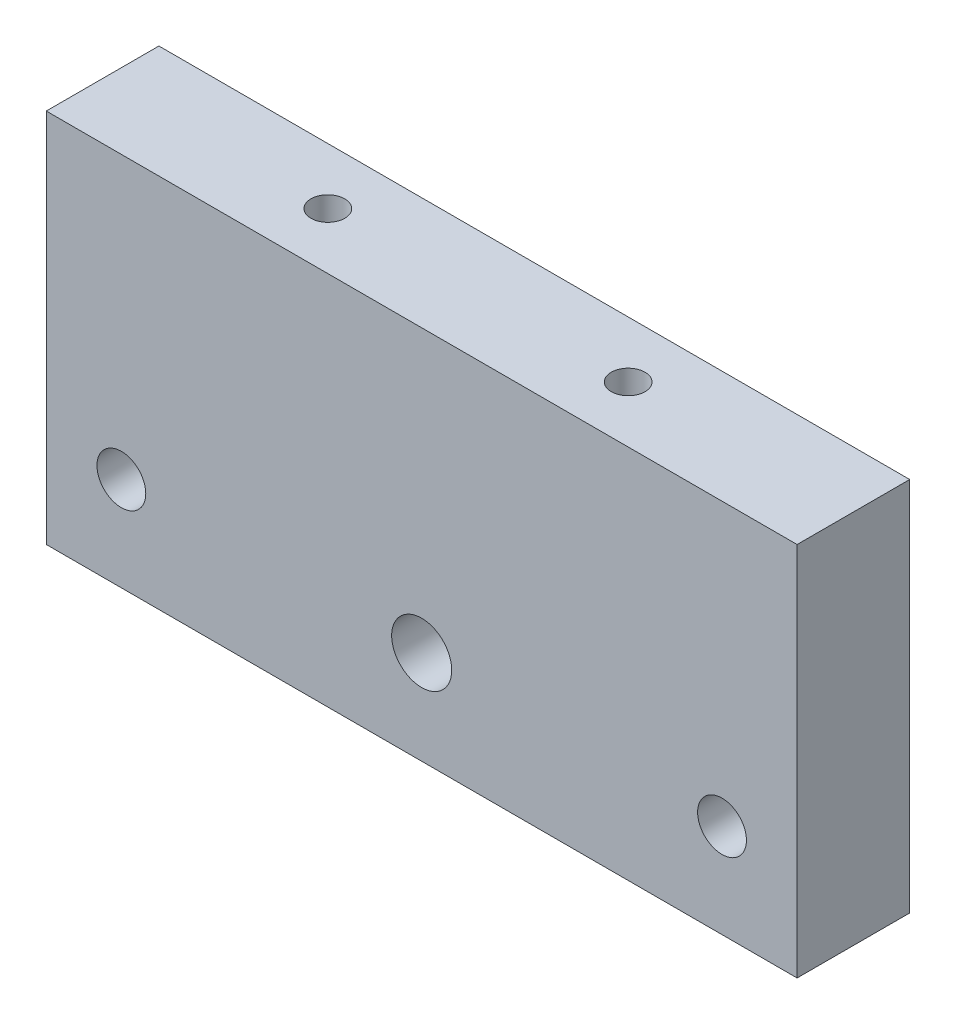
ISO-10303-21;
HEADER;
FILE_DESCRIPTION(('STEP AP214'),'2;1');
FILE_NAME('part.step','',(''),(''),'','','');
FILE_SCHEMA(('AUTOMOTIVE_DESIGN { 1 0 10303 214 1 1 1 1 }'));
ENDSEC;
DATA;
#1=APPLICATION_CONTEXT('core data for automotive mechanical design processes');
#2=APPLICATION_PROTOCOL_DEFINITION('international standard','automotive_design',2000,#1);
#3=PRODUCT_CONTEXT('',#1,'mechanical');
#4=PRODUCT('Part','Part','',(#3));
#5=PRODUCT_RELATED_PRODUCT_CATEGORY('part','',(#4));
#6=PRODUCT_DEFINITION_FORMATION('','',#4);
#7=PRODUCT_DEFINITION_CONTEXT('part definition',#1,'design');
#8=PRODUCT_DEFINITION('design','',#6,#7);
#9=PRODUCT_DEFINITION_SHAPE('','',#8);
#10=(LENGTH_UNIT() NAMED_UNIT(*) SI_UNIT(.MILLI.,.METRE.));
#11=(NAMED_UNIT(*) PLANE_ANGLE_UNIT() SI_UNIT($,.RADIAN.));
#12=(NAMED_UNIT(*) SI_UNIT($,.STERADIAN.) SOLID_ANGLE_UNIT());
#13=UNCERTAINTY_MEASURE_WITH_UNIT(LENGTH_MEASURE(1.E-05),#10,'distance_accuracy_value','');
#14=(GEOMETRIC_REPRESENTATION_CONTEXT(3) GLOBAL_UNCERTAINTY_ASSIGNED_CONTEXT((#13)) GLOBAL_UNIT_ASSIGNED_CONTEXT((#10,
#11,#12)) REPRESENTATION_CONTEXT('',''));
#15=CARTESIAN_POINT('',(0.,0.,0.));
#16=DIRECTION('',(0.,0.,1.));
#17=DIRECTION('',(1.,0.,0.));
#18=AXIS2_PLACEMENT_3D('',#15,#16,#17);
#19=CARTESIAN_POINT('',(100.,25.,0.));
#20=DIRECTION('',(0.,0.,1.));
#21=DIRECTION('',(1.,0.,0.));
#22=AXIS2_PLACEMENT_3D('',#19,#20,#21);
#23=CYLINDRICAL_SURFACE('',#22,8.00000000000001);
#24=CARTESIAN_POINT('',(100.,25.,30.));
#25=DIRECTION('',(0.,0.,1.));
#26=DIRECTION('',(1.,0.,0.));
#27=AXIS2_PLACEMENT_3D('',#24,#25,#26);
#28=CIRCLE('',#27,8.00000000000001);
#29=CARTESIAN_POINT('',(108.,25.,30.));
#30=VERTEX_POINT('',#29);
#31=EDGE_CURVE('E163',#30,#30,#28,.T.);
#32=ORIENTED_EDGE('',*,*,#31,.T.);
#33=EDGE_LOOP('',(#32));
#34=FACE_BOUND('',#33,.T.);
#35=CARTESIAN_POINT('',(100.,25.,15.));
#36=DIRECTION('',(0.,0.,-1.));
#37=DIRECTION('',(-1.,0.,0.));
#38=AXIS2_PLACEMENT_3D('',#35,#36,#37);
#39=CIRCLE('',#38,8.00000000000001);
#40=CARTESIAN_POINT('',(92.,25.,15.));
#41=VERTEX_POINT('',#40);
#42=EDGE_CURVE('E40',#41,#41,#39,.F.);
#43=ORIENTED_EDGE('',*,*,#42,.F.);
#44=EDGE_LOOP('',(#43));
#45=FACE_BOUND('',#44,.T.);
#46=ADVANCED_FACE('F36',(#34,#45),#23,.F.);
#47=CARTESIAN_POINT('',(180.,25.,0.));
#48=DIRECTION('',(0.,0.,1.));
#49=DIRECTION('',(1.,0.,0.));
#50=AXIS2_PLACEMENT_3D('',#47,#48,#49);
#51=CYLINDRICAL_SURFACE('',#50,4.49999999999999);
#52=CARTESIAN_POINT('',(180.,25.,0.));
#53=DIRECTION('',(0.,0.,1.));
#54=DIRECTION('',(1.,0.,0.));
#55=AXIS2_PLACEMENT_3D('',#52,#53,#54);
#56=CIRCLE('',#55,4.49999999999999);
#57=CARTESIAN_POINT('',(184.5,25.,0.));
#58=VERTEX_POINT('',#57);
#59=EDGE_CURVE('E160',#58,#58,#56,.T.);
#60=ORIENTED_EDGE('',*,*,#59,.F.);
#61=EDGE_LOOP('',(#60));
#62=FACE_BOUND('',#61,.T.);
#63=CARTESIAN_POINT('',(180.,25.,15.));
#64=DIRECTION('',(0.,0.,1.));
#65=DIRECTION('',(1.,0.,0.));
#66=AXIS2_PLACEMENT_3D('',#63,#64,#65);
#67=CIRCLE('',#66,4.49999999999999);
#68=CARTESIAN_POINT('',(184.5,25.,15.));
#69=VERTEX_POINT('',#68);
#70=EDGE_CURVE('E126',#69,#69,#67,.F.);
#71=ORIENTED_EDGE('',*,*,#70,.F.);
#72=EDGE_LOOP('',(#71));
#73=FACE_BOUND('',#72,.T.);
#74=ADVANCED_FACE('F176',(#62,#73),#51,.F.);
#75=CARTESIAN_POINT('',(20.,25.,0.));
#76=DIRECTION('',(0.,0.,1.));
#77=DIRECTION('',(1.,0.,0.));
#78=AXIS2_PLACEMENT_3D('',#75,#76,#77);
#79=CYLINDRICAL_SURFACE('',#78,4.5);
#80=CARTESIAN_POINT('',(20.,25.,0.));
#81=DIRECTION('',(0.,0.,1.));
#82=DIRECTION('',(1.,0.,0.));
#83=AXIS2_PLACEMENT_3D('',#80,#81,#82);
#84=CIRCLE('',#83,4.5);
#85=CARTESIAN_POINT('',(24.5,25.,0.));
#86=VERTEX_POINT('',#85);
#87=EDGE_CURVE('E106',#86,#86,#84,.T.);
#88=ORIENTED_EDGE('',*,*,#87,.F.);
#89=EDGE_LOOP('',(#88));
#90=FACE_BOUND('',#89,.T.);
#91=CARTESIAN_POINT('',(20.,25.,15.));
#92=DIRECTION('',(0.,0.,1.));
#93=DIRECTION('',(1.,0.,0.));
#94=AXIS2_PLACEMENT_3D('',#91,#92,#93);
#95=CIRCLE('',#94,4.5);
#96=CARTESIAN_POINT('',(24.5,25.,15.));
#97=VERTEX_POINT('',#96);
#98=EDGE_CURVE('E122',#97,#97,#95,.F.);
#99=ORIENTED_EDGE('',*,*,#98,.F.);
#100=EDGE_LOOP('',(#99));
#101=FACE_BOUND('',#100,.T.);
#102=ADVANCED_FACE('F172',(#90,#101),#79,.F.);
#103=CARTESIAN_POINT('',(140.,100.,15.));
#104=DIRECTION('',(0.,-1.,0.));
#105=DIRECTION('',(0.,0.,-1.));
#106=AXIS2_PLACEMENT_3D('',#103,#104,#105);
#107=CYLINDRICAL_SURFACE('',#106,4.49999999999999);
#108=CARTESIAN_POINT('',(140.,100.,15.));
#109=DIRECTION('',(0.,-1.,0.));
#110=DIRECTION('',(0.,0.,-1.));
#111=AXIS2_PLACEMENT_3D('',#108,#109,#110);
#112=CIRCLE('',#111,4.49999999999999);
#113=CARTESIAN_POINT('',(140.,100.,10.5));
#114=VERTEX_POINT('',#113);
#115=EDGE_CURVE('E115',#114,#114,#112,.T.);
#116=ORIENTED_EDGE('',*,*,#115,.F.);
#117=EDGE_LOOP('',(#116));
#118=FACE_BOUND('',#117,.T.);
#119=CARTESIAN_POINT('',(140.,50.,15.));
#120=DIRECTION('',(0.,-1.,0.));
#121=DIRECTION('',(0.,0.,-1.));
#122=AXIS2_PLACEMENT_3D('',#119,#120,#121);
#123=CIRCLE('',#122,4.49999999999999);
#124=CARTESIAN_POINT('',(140.,50.,10.5));
#125=VERTEX_POINT('',#124);
#126=EDGE_CURVE('E117',#125,#125,#123,.F.);
#127=ORIENTED_EDGE('',*,*,#126,.F.);
#128=EDGE_LOOP('',(#127));
#129=FACE_BOUND('',#128,.T.);
#130=ADVANCED_FACE('F175',(#118,#129),#107,.F.);
#131=CARTESIAN_POINT('',(60.,100.,15.));
#132=DIRECTION('',(0.,-1.,0.));
#133=DIRECTION('',(0.,0.,-1.));
#134=AXIS2_PLACEMENT_3D('',#131,#132,#133);
#135=CYLINDRICAL_SURFACE('',#134,4.5);
#136=CARTESIAN_POINT('',(60.,100.,15.));
#137=DIRECTION('',(0.,-1.,0.));
#138=DIRECTION('',(0.,0.,-1.));
#139=AXIS2_PLACEMENT_3D('',#136,#137,#138);
#140=CIRCLE('',#139,4.5);
#141=CARTESIAN_POINT('',(60.,100.,10.5));
#142=VERTEX_POINT('',#141);
#143=EDGE_CURVE('E157',#142,#142,#140,.T.);
#144=ORIENTED_EDGE('',*,*,#143,.F.);
#145=EDGE_LOOP('',(#144));
#146=FACE_BOUND('',#145,.T.);
#147=CARTESIAN_POINT('',(60.,50.,15.));
#148=DIRECTION('',(0.,-1.,0.));
#149=DIRECTION('',(0.,0.,-1.));
#150=AXIS2_PLACEMENT_3D('',#147,#148,#149);
#151=CIRCLE('',#150,4.5);
#152=CARTESIAN_POINT('',(60.,50.,10.5));
#153=VERTEX_POINT('',#152);
#154=EDGE_CURVE('E112',#153,#153,#151,.F.);
#155=ORIENTED_EDGE('',*,*,#154,.F.);
#156=EDGE_LOOP('',(#155));
#157=FACE_BOUND('',#156,.T.);
#158=ADVANCED_FACE('F225',(#146,#157),#135,.F.);
#159=CARTESIAN_POINT('',(0.,0.,30.));
#160=DIRECTION('',(1.,0.,0.));
#161=DIRECTION('',(0.,0.,-1.));
#162=AXIS2_PLACEMENT_3D('',#159,#160,#161);
#163=PLANE('',#162);
#164=DIRECTION('',(0.,-1.,0.));
#165=VECTOR('',#164,1.);
#166=CARTESIAN_POINT('',(0.,0.,0.));
#167=LINE('',#166,#165);
#168=CARTESIAN_POINT('',(0.,100.,0.));
#169=VERTEX_POINT('',#168);
#170=CARTESIAN_POINT('',(0.,0.,0.));
#171=VERTEX_POINT('',#170);
#172=EDGE_CURVE('E103',#169,#171,#167,.T.);
#173=ORIENTED_EDGE('',*,*,#172,.T.);
#174=DIRECTION('',(0.,0.,-1.));
#175=VECTOR('',#174,1.);
#176=CARTESIAN_POINT('',(0.,0.,30.));
#177=LINE('',#176,#175);
#178=CARTESIAN_POINT('',(0.,0.,30.));
#179=VERTEX_POINT('',#178);
#180=EDGE_CURVE('E11',#179,#171,#177,.T.);
#181=ORIENTED_EDGE('',*,*,#180,.F.);
#182=DIRECTION('',(0.,-1.,0.));
#183=VECTOR('',#182,1.);
#184=CARTESIAN_POINT('',(0.,0.,30.));
#185=LINE('',#184,#183);
#186=CARTESIAN_POINT('',(0.,100.,30.));
#187=VERTEX_POINT('',#186);
#188=EDGE_CURVE('E90',#187,#179,#185,.T.);
#189=ORIENTED_EDGE('',*,*,#188,.F.);
#190=DIRECTION('',(0.,0.,-1.));
#191=VECTOR('',#190,1.);
#192=CARTESIAN_POINT('',(0.,100.,30.));
#193=LINE('',#192,#191);
#194=EDGE_CURVE('E99',#187,#169,#193,.T.);
#195=ORIENTED_EDGE('',*,*,#194,.T.);
#196=EDGE_LOOP('',(#173,#181,#189,#195));
#197=FACE_BOUND('',#196,.T.);
#198=ADVANCED_FACE('F38',(#197),#163,.F.);
#199=CARTESIAN_POINT('',(0.,0.,30.));
#200=DIRECTION('',(0.,1.,0.));
#201=DIRECTION('',(0.,0.,1.));
#202=AXIS2_PLACEMENT_3D('',#199,#200,#201);
#203=PLANE('',#202);
#204=CARTESIAN_POINT('',(140.,0.,15.));
#205=DIRECTION('',(0.,-1.,0.));
#206=DIRECTION('',(0.,0.,-1.));
#207=AXIS2_PLACEMENT_3D('',#204,#205,#206);
#208=CIRCLE('',#207,6.50000000000002);
#209=CARTESIAN_POINT('',(140.,0.,8.49999999999998));
#210=VERTEX_POINT('',#209);
#211=EDGE_CURVE('E124',#210,#210,#208,.T.);
#212=ORIENTED_EDGE('',*,*,#211,.F.);
#213=EDGE_LOOP('',(#212));
#214=FACE_BOUND('',#213,.T.);
#215=CARTESIAN_POINT('',(60.,0.,15.));
#216=DIRECTION('',(0.,-1.,0.));
#217=DIRECTION('',(0.,0.,-1.));
#218=AXIS2_PLACEMENT_3D('',#215,#216,#217);
#219=CIRCLE('',#218,6.5);
#220=CARTESIAN_POINT('',(60.,0.,8.5));
#221=VERTEX_POINT('',#220);
#222=EDGE_CURVE('E120',#221,#221,#219,.T.);
#223=ORIENTED_EDGE('',*,*,#222,.F.);
#224=EDGE_LOOP('',(#223));
#225=FACE_BOUND('',#224,.T.);
#226=DIRECTION('',(1.,0.,0.));
#227=VECTOR('',#226,1.);
#228=CARTESIAN_POINT('',(0.,0.,0.));
#229=LINE('',#228,#227);
#230=CARTESIAN_POINT('',(200.,0.,0.));
#231=VERTEX_POINT('',#230);
#232=EDGE_CURVE('E94',#171,#231,#229,.T.);
#233=ORIENTED_EDGE('',*,*,#232,.T.);
#234=DIRECTION('',(0.,0.,-1.));
#235=VECTOR('',#234,1.);
#236=CARTESIAN_POINT('',(200.,0.,30.));
#237=LINE('',#236,#235);
#238=CARTESIAN_POINT('',(200.,0.,30.));
#239=VERTEX_POINT('',#238);
#240=EDGE_CURVE('E46',#239,#231,#237,.T.);
#241=ORIENTED_EDGE('',*,*,#240,.F.);
#242=DIRECTION('',(1.,0.,0.));
#243=VECTOR('',#242,1.);
#244=CARTESIAN_POINT('',(0.,0.,30.));
#245=LINE('',#244,#243);
#246=EDGE_CURVE('E85',#179,#239,#245,.T.);
#247=ORIENTED_EDGE('',*,*,#246,.F.);
#248=ORIENTED_EDGE('',*,*,#180,.T.);
#249=EDGE_LOOP('',(#233,#241,#247,#248));
#250=FACE_BOUND('',#249,.T.);
#251=ADVANCED_FACE('F93',(#214,#225,#250),#203,.F.);
#252=CARTESIAN_POINT('',(200.,0.,30.));
#253=DIRECTION('',(-1.,0.,0.));
#254=DIRECTION('',(0.,0.,1.));
#255=AXIS2_PLACEMENT_3D('',#252,#253,#254);
#256=PLANE('',#255);
#257=DIRECTION('',(0.,1.,0.));
#258=VECTOR('',#257,1.);
#259=CARTESIAN_POINT('',(200.,0.,0.));
#260=LINE('',#259,#258);
#261=CARTESIAN_POINT('',(200.,100.,0.));
#262=VERTEX_POINT('',#261);
#263=EDGE_CURVE('E72',#231,#262,#260,.T.);
#264=ORIENTED_EDGE('',*,*,#263,.T.);
#265=DIRECTION('',(0.,0.,-1.));
#266=VECTOR('',#265,1.);
#267=CARTESIAN_POINT('',(200.,100.,30.));
#268=LINE('',#267,#266);
#269=CARTESIAN_POINT('',(200.,100.,30.));
#270=VERTEX_POINT('',#269);
#271=EDGE_CURVE('E95',#270,#262,#268,.T.);
#272=ORIENTED_EDGE('',*,*,#271,.F.);
#273=DIRECTION('',(0.,1.,0.));
#274=VECTOR('',#273,1.);
#275=CARTESIAN_POINT('',(200.,0.,30.));
#276=LINE('',#275,#274);
#277=EDGE_CURVE('E88',#239,#270,#276,.T.);
#278=ORIENTED_EDGE('',*,*,#277,.F.);
#279=ORIENTED_EDGE('',*,*,#240,.T.);
#280=EDGE_LOOP('',(#264,#272,#278,#279));
#281=FACE_BOUND('',#280,.T.);
#282=ADVANCED_FACE('F97',(#281),#256,.F.);
#283=CARTESIAN_POINT('',(0.,100.,30.));
#284=DIRECTION('',(0.,-1.,0.));
#285=DIRECTION('',(0.,0.,-1.));
#286=AXIS2_PLACEMENT_3D('',#283,#284,#285);
#287=PLANE('',#286);
#288=ORIENTED_EDGE('',*,*,#115,.T.);
#289=EDGE_LOOP('',(#288));
#290=FACE_BOUND('',#289,.T.);
#291=ORIENTED_EDGE('',*,*,#143,.T.);
#292=EDGE_LOOP('',(#291));
#293=FACE_BOUND('',#292,.T.);
#294=DIRECTION('',(-1.,0.,0.));
#295=VECTOR('',#294,1.);
#296=CARTESIAN_POINT('',(0.,100.,0.));
#297=LINE('',#296,#295);
#298=EDGE_CURVE('E78',#262,#169,#297,.T.);
#299=ORIENTED_EDGE('',*,*,#298,.T.);
#300=ORIENTED_EDGE('',*,*,#194,.F.);
#301=DIRECTION('',(-1.,0.,0.));
#302=VECTOR('',#301,1.);
#303=CARTESIAN_POINT('',(0.,100.,30.));
#304=LINE('',#303,#302);
#305=EDGE_CURVE('E55',#270,#187,#304,.T.);
#306=ORIENTED_EDGE('',*,*,#305,.F.);
#307=ORIENTED_EDGE('',*,*,#271,.T.);
#308=EDGE_LOOP('',(#299,#300,#306,#307));
#309=FACE_BOUND('',#308,.T.);
#310=ADVANCED_FACE('F210',(#290,#293,#309),#287,.F.);
#311=CARTESIAN_POINT('',(0.,0.,30.));
#312=DIRECTION('',(0.,0.,-1.));
#313=DIRECTION('',(-1.,0.,0.));
#314=AXIS2_PLACEMENT_3D('',#311,#312,#313);
#315=PLANE('',#314);
#316=CARTESIAN_POINT('',(180.,25.,30.));
#317=DIRECTION('',(0.,0.,1.));
#318=DIRECTION('',(1.,0.,0.));
#319=AXIS2_PLACEMENT_3D('',#316,#317,#318);
#320=CIRCLE('',#319,6.50000000000002);
#321=CARTESIAN_POINT('',(186.5,25.,30.));
#322=VERTEX_POINT('',#321);
#323=EDGE_CURVE('E135',#322,#322,#320,.T.);
#324=ORIENTED_EDGE('',*,*,#323,.F.);
#325=EDGE_LOOP('',(#324));
#326=FACE_BOUND('',#325,.T.);
#327=CARTESIAN_POINT('',(20.,25.,30.));
#328=DIRECTION('',(0.,0.,1.));
#329=DIRECTION('',(1.,0.,0.));
#330=AXIS2_PLACEMENT_3D('',#327,#328,#329);
#331=CIRCLE('',#330,6.5);
#332=CARTESIAN_POINT('',(26.5,25.,30.));
#333=VERTEX_POINT('',#332);
#334=EDGE_CURVE('E128',#333,#333,#331,.T.);
#335=ORIENTED_EDGE('',*,*,#334,.F.);
#336=EDGE_LOOP('',(#335));
#337=FACE_BOUND('',#336,.T.);
#338=ORIENTED_EDGE('',*,*,#31,.F.);
#339=EDGE_LOOP('',(#338));
#340=FACE_BOUND('',#339,.T.);
#341=ORIENTED_EDGE('',*,*,#188,.T.);
#342=ORIENTED_EDGE('',*,*,#246,.T.);
#343=ORIENTED_EDGE('',*,*,#277,.T.);
#344=ORIENTED_EDGE('',*,*,#305,.T.);
#345=EDGE_LOOP('',(#341,#342,#343,#344));
#346=FACE_BOUND('',#345,.T.);
#347=ADVANCED_FACE('F86',(#326,#337,#340,#346),#315,.F.);
#348=CARTESIAN_POINT('',(0.,0.,0.));
#349=DIRECTION('',(0.,0.,-1.));
#350=DIRECTION('',(-1.,0.,0.));
#351=AXIS2_PLACEMENT_3D('',#348,#349,#350);
#352=PLANE('',#351);
#353=CARTESIAN_POINT('',(100.,25.,0.));
#354=DIRECTION('',(0.,0.,-1.));
#355=DIRECTION('',(-1.,0.,0.));
#356=AXIS2_PLACEMENT_3D('',#353,#354,#355);
#357=CIRCLE('',#356,12.);
#358=CARTESIAN_POINT('',(88.,25.,0.));
#359=VERTEX_POINT('',#358);
#360=EDGE_CURVE('E142',#359,#359,#357,.T.);
#361=ORIENTED_EDGE('',*,*,#360,.F.);
#362=EDGE_LOOP('',(#361));
#363=FACE_BOUND('',#362,.T.);
#364=ORIENTED_EDGE('',*,*,#59,.T.);
#365=EDGE_LOOP('',(#364));
#366=FACE_BOUND('',#365,.T.);
#367=ORIENTED_EDGE('',*,*,#87,.T.);
#368=EDGE_LOOP('',(#367));
#369=FACE_BOUND('',#368,.T.);
#370=ORIENTED_EDGE('',*,*,#172,.F.);
#371=ORIENTED_EDGE('',*,*,#298,.F.);
#372=ORIENTED_EDGE('',*,*,#263,.F.);
#373=ORIENTED_EDGE('',*,*,#232,.F.);
#374=EDGE_LOOP('',(#370,#371,#372,#373));
#375=FACE_BOUND('',#374,.T.);
#376=ADVANCED_FACE('F169',(#363,#366,#369,#375),#352,.T.);
#377=CARTESIAN_POINT('',(60.,50.,15.));
#378=DIRECTION('',(0.,-1.,0.));
#379=DIRECTION('',(0.,0.,-1.));
#380=AXIS2_PLACEMENT_3D('',#377,#378,#379);
#381=PLANE('',#380);
#382=CARTESIAN_POINT('',(60.,50.,15.));
#383=DIRECTION('',(0.,-1.,0.));
#384=DIRECTION('',(0.,0.,-1.));
#385=AXIS2_PLACEMENT_3D('',#382,#383,#384);
#386=CIRCLE('',#385,6.5);
#387=CARTESIAN_POINT('',(60.,50.,8.5));
#388=VERTEX_POINT('',#387);
#389=EDGE_CURVE('E116',#388,#388,#386,.T.);
#390=ORIENTED_EDGE('',*,*,#389,.T.);
#391=EDGE_LOOP('',(#390));
#392=FACE_BOUND('',#391,.T.);
#393=ORIENTED_EDGE('',*,*,#154,.T.);
#394=EDGE_LOOP('',(#393));
#395=FACE_BOUND('',#394,.T.);
#396=ADVANCED_FACE('F214',(#392,#395),#381,.T.);
#397=CARTESIAN_POINT('',(60.,50.,15.));
#398=DIRECTION('',(0.,-1.,0.));
#399=DIRECTION('',(0.,0.,-1.));
#400=AXIS2_PLACEMENT_3D('',#397,#398,#399);
#401=CYLINDRICAL_SURFACE('',#400,6.5);
#402=ORIENTED_EDGE('',*,*,#389,.F.);
#403=EDGE_LOOP('',(#402));
#404=FACE_BOUND('',#403,.T.);
#405=ORIENTED_EDGE('',*,*,#222,.T.);
#406=EDGE_LOOP('',(#405));
#407=FACE_BOUND('',#406,.T.);
#408=ADVANCED_FACE('F231',(#404,#407),#401,.F.);
#409=CARTESIAN_POINT('',(140.,50.,15.));
#410=DIRECTION('',(0.,-1.,0.));
#411=DIRECTION('',(0.,0.,-1.));
#412=AXIS2_PLACEMENT_3D('',#409,#410,#411);
#413=PLANE('',#412);
#414=CARTESIAN_POINT('',(140.,50.,15.));
#415=DIRECTION('',(0.,-1.,0.));
#416=DIRECTION('',(0.,0.,-1.));
#417=AXIS2_PLACEMENT_3D('',#414,#415,#416);
#418=CIRCLE('',#417,6.50000000000002);
#419=CARTESIAN_POINT('',(140.,50.,8.49999999999998));
#420=VERTEX_POINT('',#419);
#421=EDGE_CURVE('E121',#420,#420,#418,.T.);
#422=ORIENTED_EDGE('',*,*,#421,.T.);
#423=EDGE_LOOP('',(#422));
#424=FACE_BOUND('',#423,.T.);
#425=ORIENTED_EDGE('',*,*,#126,.T.);
#426=EDGE_LOOP('',(#425));
#427=FACE_BOUND('',#426,.T.);
#428=ADVANCED_FACE('F193',(#424,#427),#413,.T.);
#429=CARTESIAN_POINT('',(140.,50.,15.));
#430=DIRECTION('',(0.,-1.,0.));
#431=DIRECTION('',(0.,0.,-1.));
#432=AXIS2_PLACEMENT_3D('',#429,#430,#431);
#433=CYLINDRICAL_SURFACE('',#432,6.50000000000002);
#434=ORIENTED_EDGE('',*,*,#421,.F.);
#435=EDGE_LOOP('',(#434));
#436=FACE_BOUND('',#435,.T.);
#437=ORIENTED_EDGE('',*,*,#211,.T.);
#438=EDGE_LOOP('',(#437));
#439=FACE_BOUND('',#438,.T.);
#440=ADVANCED_FACE('F183',(#436,#439),#433,.F.);
#441=CARTESIAN_POINT('',(20.,25.,15.));
#442=DIRECTION('',(0.,0.,1.));
#443=DIRECTION('',(1.,0.,0.));
#444=AXIS2_PLACEMENT_3D('',#441,#442,#443);
#445=PLANE('',#444);
#446=CARTESIAN_POINT('',(20.,25.,15.));
#447=DIRECTION('',(0.,0.,1.));
#448=DIRECTION('',(1.,0.,0.));
#449=AXIS2_PLACEMENT_3D('',#446,#447,#448);
#450=CIRCLE('',#449,6.5);
#451=CARTESIAN_POINT('',(26.5,25.,15.));
#452=VERTEX_POINT('',#451);
#453=EDGE_CURVE('E125',#452,#452,#450,.T.);
#454=ORIENTED_EDGE('',*,*,#453,.T.);
#455=EDGE_LOOP('',(#454));
#456=FACE_BOUND('',#455,.T.);
#457=ORIENTED_EDGE('',*,*,#98,.T.);
#458=EDGE_LOOP('',(#457));
#459=FACE_BOUND('',#458,.T.);
#460=ADVANCED_FACE('F180',(#456,#459),#445,.T.);
#461=CARTESIAN_POINT('',(20.,25.,15.));
#462=DIRECTION('',(0.,0.,1.));
#463=DIRECTION('',(1.,0.,0.));
#464=AXIS2_PLACEMENT_3D('',#461,#462,#463);
#465=CYLINDRICAL_SURFACE('',#464,6.5);
#466=ORIENTED_EDGE('',*,*,#453,.F.);
#467=EDGE_LOOP('',(#466));
#468=FACE_BOUND('',#467,.T.);
#469=ORIENTED_EDGE('',*,*,#334,.T.);
#470=EDGE_LOOP('',(#469));
#471=FACE_BOUND('',#470,.T.);
#472=ADVANCED_FACE('F182',(#468,#471),#465,.F.);
#473=CARTESIAN_POINT('',(180.,25.,15.));
#474=DIRECTION('',(0.,0.,1.));
#475=DIRECTION('',(1.,0.,0.));
#476=AXIS2_PLACEMENT_3D('',#473,#474,#475);
#477=PLANE('',#476);
#478=CARTESIAN_POINT('',(180.,25.,15.));
#479=DIRECTION('',(0.,0.,1.));
#480=DIRECTION('',(1.,0.,0.));
#481=AXIS2_PLACEMENT_3D('',#478,#479,#480);
#482=CIRCLE('',#481,6.50000000000002);
#483=CARTESIAN_POINT('',(186.5,25.,15.));
#484=VERTEX_POINT('',#483);
#485=EDGE_CURVE('E129',#484,#484,#482,.T.);
#486=ORIENTED_EDGE('',*,*,#485,.T.);
#487=EDGE_LOOP('',(#486));
#488=FACE_BOUND('',#487,.T.);
#489=ORIENTED_EDGE('',*,*,#70,.T.);
#490=EDGE_LOOP('',(#489));
#491=FACE_BOUND('',#490,.T.);
#492=ADVANCED_FACE('F190',(#488,#491),#477,.T.);
#493=CARTESIAN_POINT('',(180.,25.,15.));
#494=DIRECTION('',(0.,0.,1.));
#495=DIRECTION('',(1.,0.,0.));
#496=AXIS2_PLACEMENT_3D('',#493,#494,#495);
#497=CYLINDRICAL_SURFACE('',#496,6.50000000000002);
#498=ORIENTED_EDGE('',*,*,#485,.F.);
#499=EDGE_LOOP('',(#498));
#500=FACE_BOUND('',#499,.T.);
#501=ORIENTED_EDGE('',*,*,#323,.T.);
#502=EDGE_LOOP('',(#501));
#503=FACE_BOUND('',#502,.T.);
#504=ADVANCED_FACE('F336',(#500,#503),#497,.F.);
#505=CARTESIAN_POINT('',(100.,25.,15.));
#506=DIRECTION('',(0.,0.,-1.));
#507=DIRECTION('',(-1.,0.,0.));
#508=AXIS2_PLACEMENT_3D('',#505,#506,#507);
#509=PLANE('',#508);
#510=CARTESIAN_POINT('',(100.,25.,15.));
#511=DIRECTION('',(0.,0.,-1.));
#512=DIRECTION('',(-1.,0.,0.));
#513=AXIS2_PLACEMENT_3D('',#510,#511,#512);
#514=CIRCLE('',#513,12.);
#515=CARTESIAN_POINT('',(88.,25.,15.));
#516=VERTEX_POINT('',#515);
#517=EDGE_CURVE('E430',#516,#516,#514,.T.);
#518=ORIENTED_EDGE('',*,*,#517,.T.);
#519=EDGE_LOOP('',(#518));
#520=FACE_BOUND('',#519,.T.);
#521=ORIENTED_EDGE('',*,*,#42,.T.);
#522=EDGE_LOOP('',(#521));
#523=FACE_BOUND('',#522,.T.);
#524=ADVANCED_FACE('F345',(#520,#523),#509,.T.);
#525=CARTESIAN_POINT('',(100.,25.,15.));
#526=DIRECTION('',(0.,0.,-1.));
#527=DIRECTION('',(-1.,0.,0.));
#528=AXIS2_PLACEMENT_3D('',#525,#526,#527);
#529=CYLINDRICAL_SURFACE('',#528,12.);
#530=ORIENTED_EDGE('',*,*,#517,.F.);
#531=EDGE_LOOP('',(#530));
#532=FACE_BOUND('',#531,.T.);
#533=ORIENTED_EDGE('',*,*,#360,.T.);
#534=EDGE_LOOP('',(#533));
#535=FACE_BOUND('',#534,.T.);
#536=ADVANCED_FACE('F353',(#532,#535),#529,.F.);
#537=CLOSED_SHELL('',(#46,#74,#102,#130,#158,#198,#251,#282,#310,#347,#376,#396,#408,#428,#440,
#460,#472,#492,#504,#524,#536));
#538=MANIFOLD_SOLID_BREP('B2',#537);
#539=ADVANCED_BREP_SHAPE_REPRESENTATION('',(#18,#538),#14);
#540=SHAPE_DEFINITION_REPRESENTATION(#9,#539);
ENDSEC;
END-ISO-10303-21;
